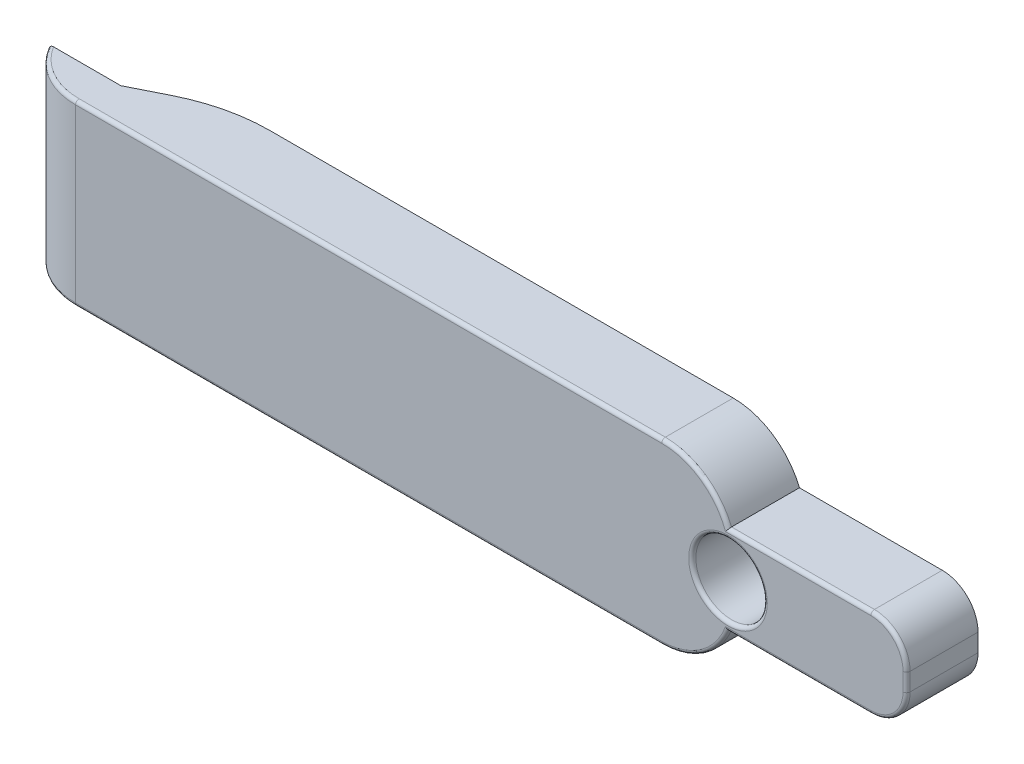
ISO-10303-21;
HEADER;
FILE_DESCRIPTION(('STEP AP214'),'2;1');
FILE_NAME('part.step','',(''),(''),'','','');
FILE_SCHEMA(('AUTOMOTIVE_DESIGN { 1 0 10303 214 1 1 1 1 }'));
ENDSEC;
DATA;
#1=APPLICATION_CONTEXT('core data for automotive mechanical design processes');
#2=APPLICATION_PROTOCOL_DEFINITION('international standard','automotive_design',2000,#1);
#3=PRODUCT_CONTEXT('',#1,'mechanical');
#4=PRODUCT('Part','Part','',(#3));
#5=PRODUCT_RELATED_PRODUCT_CATEGORY('part','',(#4));
#6=PRODUCT_DEFINITION_FORMATION('','',#4);
#7=PRODUCT_DEFINITION_CONTEXT('part definition',#1,'design');
#8=PRODUCT_DEFINITION('design','',#6,#7);
#9=PRODUCT_DEFINITION_SHAPE('','',#8);
#10=(LENGTH_UNIT() NAMED_UNIT(*) SI_UNIT(.MILLI.,.METRE.));
#11=(NAMED_UNIT(*) PLANE_ANGLE_UNIT() SI_UNIT($,.RADIAN.));
#12=(NAMED_UNIT(*) SI_UNIT($,.STERADIAN.) SOLID_ANGLE_UNIT());
#13=UNCERTAINTY_MEASURE_WITH_UNIT(LENGTH_MEASURE(1.E-05),#10,'distance_accuracy_value','');
#14=(GEOMETRIC_REPRESENTATION_CONTEXT(3) GLOBAL_UNCERTAINTY_ASSIGNED_CONTEXT((#13)) GLOBAL_UNIT_ASSIGNED_CONTEXT((#10,
#11,#12)) REPRESENTATION_CONTEXT('',''));
#15=CARTESIAN_POINT('',(0.,0.,0.));
#16=DIRECTION('',(0.,0.,1.));
#17=DIRECTION('',(1.,0.,0.));
#18=AXIS2_PLACEMENT_3D('',#15,#16,#17);
#19=CARTESIAN_POINT('',(-125.,-12.5,20.));
#20=DIRECTION('',(0.,1.,0.));
#21=DIRECTION('',(0.,0.,1.));
#22=AXIS2_PLACEMENT_3D('',#19,#20,#21);
#23=PLANE('',#22);
#24=DIRECTION('',(0.,0.,-1.));
#25=VECTOR('',#24,1.);
#26=CARTESIAN_POINT('',(115.,-12.5,20.));
#27=LINE('',#26,#25);
#28=CARTESIAN_POINT('',(115.,-12.5,0.));
#29=VERTEX_POINT('',#28);
#30=CARTESIAN_POINT('',(115.,-12.5,19.));
#31=VERTEX_POINT('',#30);
#32=EDGE_CURVE('E245',#29,#31,#27,.F.);
#33=ORIENTED_EDGE('',*,*,#32,.T.);
#34=DIRECTION('',(1.,0.,0.));
#35=VECTOR('',#34,1.);
#36=CARTESIAN_POINT('',(75.,-12.5,19.));
#37=LINE('',#36,#35);
#38=CARTESIAN_POINT('',(75.,-12.5,19.));
#39=VERTEX_POINT('',#38);
#40=EDGE_CURVE('E417',#31,#39,#37,.F.);
#41=ORIENTED_EDGE('',*,*,#40,.T.);
#42=DIRECTION('',(0.,0.,1.));
#43=VECTOR('',#42,1.);
#44=CARTESIAN_POINT('',(75.,-12.5,20.));
#45=LINE('',#44,#43);
#46=CARTESIAN_POINT('',(75.,-12.5,0.));
#47=VERTEX_POINT('',#46);
#48=EDGE_CURVE('E198',#47,#39,#45,.T.);
#49=ORIENTED_EDGE('',*,*,#48,.F.);
#50=DIRECTION('',(1.,0.,0.));
#51=VECTOR('',#50,1.);
#52=CARTESIAN_POINT('',(-125.,-12.5,0.));
#53=LINE('',#52,#51);
#54=EDGE_CURVE('E218',#47,#29,#53,.T.);
#55=ORIENTED_EDGE('',*,*,#54,.T.);
#56=EDGE_LOOP('',(#33,#41,#49,#55));
#57=FACE_BOUND('',#56,.T.);
#58=ADVANCED_FACE('F33',(#57),#23,.F.);
#59=CARTESIAN_POINT('',(-125.,12.5,20.));
#60=DIRECTION('',(0.,-1.,0.));
#61=DIRECTION('',(0.,0.,-1.));
#62=AXIS2_PLACEMENT_3D('',#59,#60,#61);
#63=PLANE('',#62);
#64=DIRECTION('',(0.,0.,-1.));
#65=VECTOR('',#64,1.);
#66=CARTESIAN_POINT('',(75.,12.5,0.));
#67=LINE('',#66,#65);
#68=CARTESIAN_POINT('',(75.,12.5,19.));
#69=VERTEX_POINT('',#68);
#70=CARTESIAN_POINT('',(75.,12.5,0.));
#71=VERTEX_POINT('',#70);
#72=EDGE_CURVE('E202',#69,#71,#67,.T.);
#73=ORIENTED_EDGE('',*,*,#72,.F.);
#74=DIRECTION('',(-1.,0.,0.));
#75=VECTOR('',#74,1.);
#76=CARTESIAN_POINT('',(115.,12.5,19.));
#77=LINE('',#76,#75);
#78=CARTESIAN_POINT('',(115.,12.5,19.));
#79=VERTEX_POINT('',#78);
#80=EDGE_CURVE('E58',#69,#79,#77,.F.);
#81=ORIENTED_EDGE('',*,*,#80,.T.);
#82=DIRECTION('',(0.,0.,-1.));
#83=VECTOR('',#82,1.);
#84=CARTESIAN_POINT('',(115.,12.5,20.));
#85=LINE('',#84,#83);
#86=CARTESIAN_POINT('',(115.,12.5,0.));
#87=VERTEX_POINT('',#86);
#88=EDGE_CURVE('E235',#79,#87,#85,.T.);
#89=ORIENTED_EDGE('',*,*,#88,.T.);
#90=DIRECTION('',(-1.,0.,0.));
#91=VECTOR('',#90,1.);
#92=CARTESIAN_POINT('',(-125.,12.5,0.));
#93=LINE('',#92,#91);
#94=EDGE_CURVE('E215',#87,#71,#93,.T.);
#95=ORIENTED_EDGE('',*,*,#94,.T.);
#96=EDGE_LOOP('',(#73,#81,#89,#95));
#97=FACE_BOUND('',#96,.T.);
#98=ADVANCED_FACE('F302',(#97),#63,.F.);
#99=CARTESIAN_POINT('',(125.,12.5,20.));
#100=DIRECTION('',(-1.,0.,0.));
#101=DIRECTION('',(0.,0.,1.));
#102=AXIS2_PLACEMENT_3D('',#99,#100,#101);
#103=PLANE('',#102);
#104=DIRECTION('',(0.,0.,-1.));
#105=VECTOR('',#104,1.);
#106=CARTESIAN_POINT('',(125.,2.5,20.));
#107=LINE('',#106,#105);
#108=CARTESIAN_POINT('',(125.,2.5,0.));
#109=VERTEX_POINT('',#108);
#110=CARTESIAN_POINT('',(125.,2.5,19.));
#111=VERTEX_POINT('',#110);
#112=EDGE_CURVE('E243',#109,#111,#107,.F.);
#113=ORIENTED_EDGE('',*,*,#112,.T.);
#114=DIRECTION('',(0.,1.,0.));
#115=VECTOR('',#114,1.);
#116=CARTESIAN_POINT('',(125.,-2.5,19.));
#117=LINE('',#116,#115);
#118=CARTESIAN_POINT('',(125.,-2.5,19.));
#119=VERTEX_POINT('',#118);
#120=EDGE_CURVE('E42',#111,#119,#117,.F.);
#121=ORIENTED_EDGE('',*,*,#120,.T.);
#122=DIRECTION('',(0.,0.,-1.));
#123=VECTOR('',#122,1.);
#124=CARTESIAN_POINT('',(125.,-2.5,20.));
#125=LINE('',#124,#123);
#126=CARTESIAN_POINT('',(125.,-2.5,0.));
#127=VERTEX_POINT('',#126);
#128=EDGE_CURVE('E241',#119,#127,#125,.T.);
#129=ORIENTED_EDGE('',*,*,#128,.T.);
#130=DIRECTION('',(0.,1.,0.));
#131=VECTOR('',#130,1.);
#132=CARTESIAN_POINT('',(125.,12.5,0.));
#133=LINE('',#132,#131);
#134=EDGE_CURVE('E212',#127,#109,#133,.T.);
#135=ORIENTED_EDGE('',*,*,#134,.T.);
#136=EDGE_LOOP('',(#113,#121,#129,#135));
#137=FACE_BOUND('',#136,.T.);
#138=ADVANCED_FACE('F295',(#137),#103,.F.);
#139=CARTESIAN_POINT('',(0.,0.,20.));
#140=DIRECTION('',(0.,0.,1.));
#141=DIRECTION('',(1.,0.,0.));
#142=AXIS2_PLACEMENT_3D('',#139,#140,#141);
#143=PLANE('',#142);
#144=DIRECTION('',(0.,1.,0.));
#145=VECTOR('',#144,1.);
#146=CARTESIAN_POINT('',(-107.679491924311,-25.,20.));
#147=LINE('',#146,#145);
#148=CARTESIAN_POINT('',(-107.679491924311,24.,20.));
#149=VERTEX_POINT('',#148);
#150=CARTESIAN_POINT('',(-107.679491924311,-24.,20.));
#151=VERTEX_POINT('',#150);
#152=EDGE_CURVE('E221',#149,#151,#147,.F.);
#153=ORIENTED_EDGE('',*,*,#152,.T.);
#154=DIRECTION('',(-1.,0.,0.));
#155=VECTOR('',#154,1.);
#156=CARTESIAN_POINT('',(0.,-24.,20.));
#157=LINE('',#156,#155);
#158=CARTESIAN_POINT('',(56.4595037822609,-24.,20.));
#159=VERTEX_POINT('',#158);
#160=EDGE_CURVE('E430',#151,#159,#157,.F.);
#161=ORIENTED_EDGE('',*,*,#160,.T.);
#162=CARTESIAN_POINT('',(56.4595037822609,-5.,20.));
#163=DIRECTION('',(0.,0.,1.));
#164=DIRECTION('',(1.,0.,0.));
#165=AXIS2_PLACEMENT_3D('',#162,#163,#164);
#166=CIRCLE('',#165,19.);
#167=CARTESIAN_POINT('',(74.313074853618,-11.5,20.));
#168=VERTEX_POINT('',#167);
#169=EDGE_CURVE('E434',#159,#168,#166,.T.);
#170=ORIENTED_EDGE('',*,*,#169,.T.);
#171=DIRECTION('',(1.,0.,0.));
#172=VECTOR('',#171,1.);
#173=CARTESIAN_POINT('',(115.,-11.5,20.));
#174=LINE('',#173,#172);
#175=CARTESIAN_POINT('',(115.,-11.5,20.));
#176=VERTEX_POINT('',#175);
#177=EDGE_CURVE('E437',#168,#176,#174,.T.);
#178=ORIENTED_EDGE('',*,*,#177,.T.);
#179=CARTESIAN_POINT('',(115.,-2.5,20.));
#180=DIRECTION('',(0.,0.,1.));
#181=DIRECTION('',(1.,0.,0.));
#182=AXIS2_PLACEMENT_3D('',#179,#180,#181);
#183=CIRCLE('',#182,9.);
#184=CARTESIAN_POINT('',(124.,-2.5,20.));
#185=VERTEX_POINT('',#184);
#186=EDGE_CURVE('E441',#176,#185,#183,.T.);
#187=ORIENTED_EDGE('',*,*,#186,.T.);
#188=DIRECTION('',(0.,1.,0.));
#189=VECTOR('',#188,1.);
#190=CARTESIAN_POINT('',(124.,2.5,20.));
#191=LINE('',#190,#189);
#192=CARTESIAN_POINT('',(124.,2.5,20.));
#193=VERTEX_POINT('',#192);
#194=EDGE_CURVE('E464',#185,#193,#191,.T.);
#195=ORIENTED_EDGE('',*,*,#194,.T.);
#196=CARTESIAN_POINT('',(115.,2.5,20.));
#197=DIRECTION('',(0.,0.,1.));
#198=DIRECTION('',(1.,0.,0.));
#199=AXIS2_PLACEMENT_3D('',#196,#197,#198);
#200=CIRCLE('',#199,9.);
#201=CARTESIAN_POINT('',(115.,11.5,20.));
#202=VERTEX_POINT('',#201);
#203=EDGE_CURVE('E462',#193,#202,#200,.T.);
#204=ORIENTED_EDGE('',*,*,#203,.T.);
#205=DIRECTION('',(-1.,0.,0.));
#206=VECTOR('',#205,1.);
#207=CARTESIAN_POINT('',(75.,11.5,20.));
#208=LINE('',#207,#206);
#209=CARTESIAN_POINT('',(74.313074853618,11.5,20.));
#210=VERTEX_POINT('',#209);
#211=EDGE_CURVE('E460',#202,#210,#208,.T.);
#212=ORIENTED_EDGE('',*,*,#211,.T.);
#213=CARTESIAN_POINT('',(56.4595037822609,5.,20.));
#214=DIRECTION('',(0.,0.,1.));
#215=DIRECTION('',(1.,0.,0.));
#216=AXIS2_PLACEMENT_3D('',#213,#214,#215);
#217=CIRCLE('',#216,19.);
#218=CARTESIAN_POINT('',(56.4595037822609,24.,20.));
#219=VERTEX_POINT('',#218);
#220=EDGE_CURVE('E411',#210,#219,#217,.T.);
#221=ORIENTED_EDGE('',*,*,#220,.T.);
#222=DIRECTION('',(1.,0.,0.));
#223=VECTOR('',#222,1.);
#224=CARTESIAN_POINT('',(0.,24.,20.));
#225=LINE('',#224,#223);
#226=EDGE_CURVE('E403',#219,#149,#225,.F.);
#227=ORIENTED_EDGE('',*,*,#226,.T.);
#228=EDGE_LOOP('',(#153,#161,#170,#178,#187,#195,#204,#212,#221,#227));
#229=FACE_BOUND('',#228,.T.);
#230=CARTESIAN_POINT('',(75.,0.,20.));
#231=DIRECTION('',(0.,0.,1.));
#232=DIRECTION('',(1.,0.,0.));
#233=AXIS2_PLACEMENT_3D('',#230,#231,#232);
#234=CIRCLE('',#233,11.);
#235=CARTESIAN_POINT('',(86.,0.,20.));
#236=VERTEX_POINT('',#235);
#237=EDGE_CURVE('E466',#236,#236,#234,.F.);
#238=ORIENTED_EDGE('',*,*,#237,.T.);
#239=EDGE_LOOP('',(#238));
#240=FACE_BOUND('',#239,.T.);
#241=ADVANCED_FACE('F292',(#229,#240),#143,.T.);
#242=CARTESIAN_POINT('',(0.,0.,0.));
#243=DIRECTION('',(0.,0.,1.));
#244=DIRECTION('',(1.,0.,0.));
#245=AXIS2_PLACEMENT_3D('',#242,#243,#244);
#246=PLANE('',#245);
#247=CARTESIAN_POINT('',(75.,0.,0.));
#248=DIRECTION('',(0.,0.,1.));
#249=DIRECTION('',(1.,0.,0.));
#250=AXIS2_PLACEMENT_3D('',#247,#248,#249);
#251=CIRCLE('',#250,9.99999999999999);
#252=CARTESIAN_POINT('',(85.,0.,0.));
#253=VERTEX_POINT('',#252);
#254=EDGE_CURVE('E208',#253,#253,#251,.T.);
#255=ORIENTED_EDGE('',*,*,#254,.T.);
#256=EDGE_LOOP('',(#255));
#257=FACE_BOUND('',#256,.T.);
#258=DIRECTION('',(1.,0.,0.));
#259=VECTOR('',#258,1.);
#260=CARTESIAN_POINT('',(-125.,-25.,0.));
#261=LINE('',#260,#259);
#262=CARTESIAN_POINT('',(-73.1966011250105,-25.,0.));
#263=VERTEX_POINT('',#262);
#264=CARTESIAN_POINT('',(56.4595037822609,-25.,0.));
#265=VERTEX_POINT('',#264);
#266=EDGE_CURVE('E200',#263,#265,#261,.T.);
#267=ORIENTED_EDGE('',*,*,#266,.F.);
#268=DIRECTION('',(0.,1.,0.));
#269=VECTOR('',#268,1.);
#270=CARTESIAN_POINT('',(-73.1966011250105,0.,0.));
#271=LINE('',#270,#269);
#272=CARTESIAN_POINT('',(-73.1966011250105,25.,0.));
#273=VERTEX_POINT('',#272);
#274=EDGE_CURVE('E248',#263,#273,#271,.T.);
#275=ORIENTED_EDGE('',*,*,#274,.T.);
#276=DIRECTION('',(-1.,0.,0.));
#277=VECTOR('',#276,1.);
#278=CARTESIAN_POINT('',(-125.,25.,0.));
#279=LINE('',#278,#277);
#280=CARTESIAN_POINT('',(56.4595037822609,25.,0.));
#281=VERTEX_POINT('',#280);
#282=EDGE_CURVE('E205',#281,#273,#279,.T.);
#283=ORIENTED_EDGE('',*,*,#282,.F.);
#284=CARTESIAN_POINT('',(56.4595037822609,5.,0.));
#285=DIRECTION('',(0.,0.,1.));
#286=DIRECTION('',(1.,0.,0.));
#287=AXIS2_PLACEMENT_3D('',#284,#285,#286);
#288=CIRCLE('',#287,20.);
#289=EDGE_CURVE('E227',#281,#71,#288,.F.);
#290=ORIENTED_EDGE('',*,*,#289,.T.);
#291=ORIENTED_EDGE('',*,*,#94,.F.);
#292=CARTESIAN_POINT('',(115.,2.5,0.));
#293=DIRECTION('',(0.,0.,1.));
#294=DIRECTION('',(1.,0.,0.));
#295=AXIS2_PLACEMENT_3D('',#292,#293,#294);
#296=CIRCLE('',#295,10.);
#297=EDGE_CURVE('E239',#87,#109,#296,.F.);
#298=ORIENTED_EDGE('',*,*,#297,.T.);
#299=ORIENTED_EDGE('',*,*,#134,.F.);
#300=CARTESIAN_POINT('',(115.,-2.5,0.));
#301=DIRECTION('',(0.,0.,1.));
#302=DIRECTION('',(1.,0.,0.));
#303=AXIS2_PLACEMENT_3D('',#300,#301,#302);
#304=CIRCLE('',#303,10.);
#305=EDGE_CURVE('E237',#127,#29,#304,.F.);
#306=ORIENTED_EDGE('',*,*,#305,.T.);
#307=ORIENTED_EDGE('',*,*,#54,.F.);
#308=CARTESIAN_POINT('',(56.4595037822609,-5.,0.));
#309=DIRECTION('',(0.,0.,1.));
#310=DIRECTION('',(1.,0.,0.));
#311=AXIS2_PLACEMENT_3D('',#308,#309,#310);
#312=CIRCLE('',#311,20.);
#313=EDGE_CURVE('E230',#47,#265,#312,.F.);
#314=ORIENTED_EDGE('',*,*,#313,.T.);
#315=EDGE_LOOP('',(#267,#275,#283,#290,#291,#298,#299,#306,#307,#314));
#316=FACE_BOUND('',#315,.T.);
#317=ADVANCED_FACE('F290',(#257,#316),#246,.F.);
#318=CARTESIAN_POINT('',(75.,0.,0.));
#319=DIRECTION('',(0.,0.,1.));
#320=DIRECTION('',(1.,0.,0.));
#321=AXIS2_PLACEMENT_3D('',#318,#319,#320);
#322=CYLINDRICAL_SURFACE('',#321,9.99999999999999);
#323=CARTESIAN_POINT('',(75.,0.,19.));
#324=DIRECTION('',(0.,0.,1.));
#325=DIRECTION('',(1.,0.,0.));
#326=AXIS2_PLACEMENT_3D('',#323,#324,#325);
#327=CIRCLE('',#326,9.99999999999999);
#328=CARTESIAN_POINT('',(85.,0.,19.));
#329=VERTEX_POINT('',#328);
#330=EDGE_CURVE('E11',#329,#329,#327,.T.);
#331=ORIENTED_EDGE('',*,*,#330,.T.);
#332=EDGE_LOOP('',(#331));
#333=FACE_BOUND('',#332,.T.);
#334=ORIENTED_EDGE('',*,*,#254,.F.);
#335=EDGE_LOOP('',(#334));
#336=FACE_BOUND('',#335,.T.);
#337=ADVANCED_FACE('F286',(#333,#336),#322,.F.);
#338=CARTESIAN_POINT('',(0.,25.,0.));
#339=DIRECTION('',(0.,1.,0.));
#340=DIRECTION('',(0.,0.,1.));
#341=AXIS2_PLACEMENT_3D('',#338,#339,#340);
#342=PLANE('',#341);
#343=DIRECTION('',(1.,0.,0.));
#344=VECTOR('',#343,1.);
#345=CARTESIAN_POINT('',(0.,25.,9.99999999999999));
#346=LINE('',#345,#344);
#347=CARTESIAN_POINT('',(-123.834986345715,25.,9.99999999999999));
#348=VERTEX_POINT('',#347);
#349=CARTESIAN_POINT('',(-105.,25.,9.99999999999999));
#350=VERTEX_POINT('',#349);
#351=EDGE_CURVE('E184',#348,#350,#346,.T.);
#352=ORIENTED_EDGE('',*,*,#351,.F.);
#353=CARTESIAN_POINT('',(-107.679491924311,25.,0.));
#354=DIRECTION('',(0.,1.,0.));
#355=DIRECTION('',(0.,0.,1.));
#356=AXIS2_PLACEMENT_3D('',#353,#354,#355);
#357=CIRCLE('',#356,19.);
#358=CARTESIAN_POINT('',(-107.679491924311,25.,19.));
#359=VERTEX_POINT('',#358);
#360=EDGE_CURVE('E469',#348,#359,#357,.T.);
#361=ORIENTED_EDGE('',*,*,#360,.T.);
#362=DIRECTION('',(1.,0.,0.));
#363=VECTOR('',#362,1.);
#364=CARTESIAN_POINT('',(0.,25.,19.));
#365=LINE('',#364,#363);
#366=CARTESIAN_POINT('',(56.4595037822609,25.,19.));
#367=VERTEX_POINT('',#366);
#368=EDGE_CURVE('E405',#359,#367,#365,.T.);
#369=ORIENTED_EDGE('',*,*,#368,.T.);
#370=DIRECTION('',(0.,0.,-1.));
#371=VECTOR('',#370,1.);
#372=CARTESIAN_POINT('',(56.4595037822609,25.,0.));
#373=LINE('',#372,#371);
#374=EDGE_CURVE('E233',#367,#281,#373,.T.);
#375=ORIENTED_EDGE('',*,*,#374,.T.);
#376=ORIENTED_EDGE('',*,*,#282,.T.);
#377=CARTESIAN_POINT('',(-73.1966011250105,25.,50.));
#378=DIRECTION('',(0.,1.,0.));
#379=DIRECTION('',(0.,0.,1.));
#380=AXIS2_PLACEMENT_3D('',#377,#378,#379);
#381=CIRCLE('',#380,50.);
#382=CARTESIAN_POINT('',(-95.5572809000084,25.,5.27864045000422));
#383=VERTEX_POINT('',#382);
#384=EDGE_CURVE('E251',#273,#383,#381,.T.);
#385=ORIENTED_EDGE('',*,*,#384,.T.);
#386=DIRECTION('',(0.894427190999916,0.,-0.447213595499958));
#387=VECTOR('',#386,1.);
#388=CARTESIAN_POINT('',(-17.,25.,-34.));
#389=LINE('',#388,#387);
#390=EDGE_CURVE('E178',#350,#383,#389,.T.);
#391=ORIENTED_EDGE('',*,*,#390,.F.);
#392=EDGE_LOOP('',(#352,#361,#369,#375,#376,#385,#391));
#393=FACE_BOUND('',#392,.T.);
#394=ADVANCED_FACE('F283',(#393),#342,.T.);
#395=CARTESIAN_POINT('',(0.,-25.,0.));
#396=DIRECTION('',(0.,-1.,0.));
#397=DIRECTION('',(0.,0.,-1.));
#398=AXIS2_PLACEMENT_3D('',#395,#396,#397);
#399=PLANE('',#398);
#400=DIRECTION('',(-1.,0.,0.));
#401=VECTOR('',#400,1.);
#402=CARTESIAN_POINT('',(0.,-25.,19.));
#403=LINE('',#402,#401);
#404=CARTESIAN_POINT('',(56.4595037822609,-25.,19.));
#405=VERTEX_POINT('',#404);
#406=CARTESIAN_POINT('',(-107.679491924311,-25.,19.));
#407=VERTEX_POINT('',#406);
#408=EDGE_CURVE('E256',#405,#407,#403,.T.);
#409=ORIENTED_EDGE('',*,*,#408,.T.);
#410=CARTESIAN_POINT('',(-107.679491924311,-25.,0.));
#411=DIRECTION('',(0.,-1.,0.));
#412=DIRECTION('',(0.,0.,-1.));
#413=AXIS2_PLACEMENT_3D('',#410,#411,#412);
#414=CIRCLE('',#413,19.);
#415=CARTESIAN_POINT('',(-123.834986345715,-25.,9.99999999999999));
#416=VERTEX_POINT('',#415);
#417=EDGE_CURVE('E176',#407,#416,#414,.T.);
#418=ORIENTED_EDGE('',*,*,#417,.T.);
#419=DIRECTION('',(1.,0.,0.));
#420=VECTOR('',#419,1.);
#421=CARTESIAN_POINT('',(0.,-25.,9.99999999999999));
#422=LINE('',#421,#420);
#423=CARTESIAN_POINT('',(-105.,-25.,9.99999999999999));
#424=VERTEX_POINT('',#423);
#425=EDGE_CURVE('E169',#416,#424,#422,.T.);
#426=ORIENTED_EDGE('',*,*,#425,.T.);
#427=DIRECTION('',(0.894427190999916,0.,-0.447213595499958));
#428=VECTOR('',#427,1.);
#429=CARTESIAN_POINT('',(-17.,-25.,-34.));
#430=LINE('',#429,#428);
#431=CARTESIAN_POINT('',(-95.5572809000084,-25.,5.27864045000422));
#432=VERTEX_POINT('',#431);
#433=EDGE_CURVE('E173',#424,#432,#430,.T.);
#434=ORIENTED_EDGE('',*,*,#433,.T.);
#435=CARTESIAN_POINT('',(-73.1966011250105,-25.,50.));
#436=DIRECTION('',(0.,-1.,0.));
#437=DIRECTION('',(0.,0.,-1.));
#438=AXIS2_PLACEMENT_3D('',#435,#436,#437);
#439=CIRCLE('',#438,50.);
#440=EDGE_CURVE('E254',#432,#263,#439,.T.);
#441=ORIENTED_EDGE('',*,*,#440,.T.);
#442=ORIENTED_EDGE('',*,*,#266,.T.);
#443=DIRECTION('',(0.,0.,1.));
#444=VECTOR('',#443,1.);
#445=CARTESIAN_POINT('',(56.4595037822609,-25.,20.));
#446=LINE('',#445,#444);
#447=EDGE_CURVE('E224',#265,#405,#446,.T.);
#448=ORIENTED_EDGE('',*,*,#447,.T.);
#449=EDGE_LOOP('',(#409,#418,#426,#434,#441,#442,#448));
#450=FACE_BOUND('',#449,.T.);
#451=ADVANCED_FACE('F171',(#450),#399,.T.);
#452=CARTESIAN_POINT('',(0.,-25.,9.99999999999999));
#453=DIRECTION('',(0.,0.,1.));
#454=DIRECTION('',(1.,0.,0.));
#455=AXIS2_PLACEMENT_3D('',#452,#453,#454);
#456=PLANE('',#455);
#457=ORIENTED_EDGE('',*,*,#425,.F.);
#458=CARTESIAN_POINT('',(-123.834986345715,-25.,10.));
#459=CARTESIAN_POINT('',(-123.919917220122,-25.0000285599102,10.));
#460=CARTESIAN_POINT('',(-124.005030309426,-24.9921723234084,9.99999999999999));
#461=CARTESIAN_POINT('',(-124.172864695107,-24.9604349438292,9.99999999999999));
#462=CARTESIAN_POINT('',(-124.255562775183,-24.9364319367959,9.99999999999999));
#463=CARTESIAN_POINT('',(-124.40496765522,-24.8759618621725,9.99999999999999));
#464=CARTESIAN_POINT('',(-124.472406753829,-24.8413158320357,9.99999999999999));
#465=CARTESIAN_POINT('',(-124.599101877342,-24.7596942646283,9.99999999999999));
#466=CARTESIAN_POINT('',(-124.658392407145,-24.7127733234086,9.99999999999999));
#467=CARTESIAN_POINT('',(-124.751303753561,-24.6216155492239,9.99999999999999));
#468=CARTESIAN_POINT('',(-124.787544647487,-24.5800328140528,9.99999999999999));
#469=CARTESIAN_POINT('',(-124.852658949184,-24.4913701268911,9.99999999999999));
#470=CARTESIAN_POINT('',(-124.881529874594,-24.4442883304633,9.99999999999999));
#471=CARTESIAN_POINT('',(-124.930655600588,-24.3454877469404,9.99999999999999));
#472=CARTESIAN_POINT('',(-124.950862570228,-24.2937450795241,9.99999999999999));
#473=CARTESIAN_POINT('',(-124.981280625944,-24.1874550590689,9.99999999999999));
#474=CARTESIAN_POINT('',(-124.991515711746,-24.1329147741831,9.99999999999999));
#475=CARTESIAN_POINT('',(-124.997655527604,-24.0650230622574,9.99999999999999));
#476=CARTESIAN_POINT('',(-124.998534898402,-24.0520244947294,9.99999999999999));
#477=CARTESIAN_POINT('',(-124.99970615752,-24.0260191155274,9.99999999999999));
#478=CARTESIAN_POINT('',(-124.999998865853,-24.0130123408161,9.99999999999999));
#479=CARTESIAN_POINT('',(-125.,-24.,9.99999999999999));
#480=B_SPLINE_CURVE_WITH_KNOTS('',3,(#458,#459,#460,#461,#462,#463,#464,#465,#466,#467,#468,
#469,#470,#471,#472,#473,#474,#475,#476,#477,#478,#479),.UNSPECIFIED.,.F.,.F.,(4,2,2,2,2,2,2,2,
2,2,4),(0.,0.254740994574176,0.511426484328141,0.737595952457424,0.962776084734743,
1.12757398182066,1.29242731327823,1.45817938199818,1.62353153594141,1.66260880248924,
1.70163141014112),.UNSPECIFIED.);
#481=CARTESIAN_POINT('',(-125.,-24.,9.99999999999999));
#482=VERTEX_POINT('',#481);
#483=EDGE_CURVE('E266',#416,#482,#480,.T.);
#484=ORIENTED_EDGE('',*,*,#483,.T.);
#485=DIRECTION('',(0.,1.,0.));
#486=VECTOR('',#485,1.);
#487=CARTESIAN_POINT('',(-125.,-25.,9.99999999999999));
#488=LINE('',#487,#486);
#489=CARTESIAN_POINT('',(-125.,24.,9.99999999999999));
#490=VERTEX_POINT('',#489);
#491=EDGE_CURVE('E188',#482,#490,#488,.T.);
#492=ORIENTED_EDGE('',*,*,#491,.T.);
#493=CARTESIAN_POINT('',(-125.,24.,9.99999999999999));
#494=CARTESIAN_POINT('',(-125.000001655922,24.0254003968338,9.99999999999999));
#495=CARTESIAN_POINT('',(-124.998881667964,24.0507875507909,9.99999999999999));
#496=CARTESIAN_POINT('',(-124.994426079495,24.1013587438421,9.99999999999999));
#497=CARTESIAN_POINT('',(-124.991091181727,24.1265428447961,9.99999999999999));
#498=CARTESIAN_POINT('',(-124.977849043962,24.201298736227,9.99999999999999));
#499=CARTESIAN_POINT('',(-124.964703716923,24.2503326834797,9.99999999999999));
#500=CARTESIAN_POINT('',(-124.930417903282,24.3454258270451,9.99999999999999));
#501=CARTESIAN_POINT('',(-124.909283772634,24.3914873542201,9.99999999999999));
#502=CARTESIAN_POINT('',(-124.859930215839,24.4796712318034,9.99999999999999));
#503=CARTESIAN_POINT('',(-124.831705019577,24.5217903357004,9.99999999999999));
#504=CARTESIAN_POINT('',(-124.767688696776,24.6032473410345,9.99999999999999));
#505=CARTESIAN_POINT('',(-124.731591881642,24.6423438839026,9.99999999999999));
#506=CARTESIAN_POINT('',(-124.654022637454,24.7147413845242,9.99999999999999));
#507=CARTESIAN_POINT('',(-124.612549378399,24.748041445571,9.99999999999999));
#508=CARTESIAN_POINT('',(-124.519864386436,24.8123823972457,9.99999999999999));
#509=CARTESIAN_POINT('',(-124.468084463238,24.84260376372,9.99999999999999));
#510=CARTESIAN_POINT('',(-124.360621986327,24.8951658886005,9.99999999999999));
#511=CARTESIAN_POINT('',(-124.304934204105,24.9174958381225,9.99999999999999));
#512=CARTESIAN_POINT('',(-124.181329229241,24.9573402841069,9.99999999999999));
#513=CARTESIAN_POINT('',(-124.112941078576,24.9733932921453,9.99999999999999));
#514=CARTESIAN_POINT('',(-123.97466856332,24.9947143309099,9.99999999999999));
#515=CARTESIAN_POINT('',(-123.904788342,25.0000090798804,9.99999999999999));
#516=CARTESIAN_POINT('',(-123.834986345715,25.,9.99999999999999));
#517=B_SPLINE_CURVE_WITH_KNOTS('',3,(#493,#494,#495,#496,#497,#498,#499,#500,#501,#502,#503,
#504,#505,#506,#507,#508,#509,#510,#511,#512,#513,#514,#515,#516),.UNSPECIFIED.,.F.,.F.,(4,2,2,
2,2,2,2,2,2,2,2,4),(0.,0.0761507241667641,0.152277298924971,0.303765353310512,0.455133135443624,
0.60662448921494,0.765625268018931,0.924650622182798,1.10380552846922,1.28320488097372,
1.49306633753481,1.7024059608673),.UNSPECIFIED.);
#518=EDGE_CURVE('E259',#490,#348,#517,.T.);
#519=ORIENTED_EDGE('',*,*,#518,.T.);
#520=ORIENTED_EDGE('',*,*,#351,.T.);
#521=DIRECTION('',(0.,1.,0.));
#522=VECTOR('',#521,1.);
#523=CARTESIAN_POINT('',(-105.,-25.,9.99999999999999));
#524=LINE('',#523,#522);
#525=EDGE_CURVE('E181',#424,#350,#524,.T.);
#526=ORIENTED_EDGE('',*,*,#525,.F.);
#527=EDGE_LOOP('',(#457,#484,#492,#519,#520,#526));
#528=FACE_BOUND('',#527,.T.);
#529=ADVANCED_FACE('F182',(#528),#456,.F.);
#530=CARTESIAN_POINT('',(-17.,-25.,-34.));
#531=DIRECTION('',(0.447213595499958,0.,0.894427190999916));
#532=DIRECTION('',(0.894427190999916,0.,-0.447213595499958));
#533=AXIS2_PLACEMENT_3D('',#530,#531,#532);
#534=PLANE('',#533);
#535=ORIENTED_EDGE('',*,*,#390,.T.);
#536=DIRECTION('',(0.,1.,0.));
#537=VECTOR('',#536,1.);
#538=CARTESIAN_POINT('',(-95.5572809000084,-25.,5.2786404500042));
#539=LINE('',#538,#537);
#540=EDGE_CURVE('E192',#383,#432,#539,.F.);
#541=ORIENTED_EDGE('',*,*,#540,.T.);
#542=ORIENTED_EDGE('',*,*,#433,.F.);
#543=ORIENTED_EDGE('',*,*,#525,.T.);
#544=EDGE_LOOP('',(#535,#541,#542,#543));
#545=FACE_BOUND('',#544,.T.);
#546=ADVANCED_FACE('F190',(#545),#534,.F.);
#547=CARTESIAN_POINT('',(-107.679491924311,12.5,0.));
#548=DIRECTION('',(0.,-1.,0.));
#549=DIRECTION('',(0.,0.,-1.));
#550=AXIS2_PLACEMENT_3D('',#547,#548,#549);
#551=CYLINDRICAL_SURFACE('',#550,20.);
#552=ORIENTED_EDGE('',*,*,#491,.F.);
#553=CARTESIAN_POINT('',(-107.679491924311,-24.,0.));
#554=DIRECTION('',(0.,-1.,0.));
#555=DIRECTION('',(0.,0.,-1.));
#556=AXIS2_PLACEMENT_3D('',#553,#554,#555);
#557=CIRCLE('',#556,20.);
#558=EDGE_CURVE('E472',#482,#151,#557,.F.);
#559=ORIENTED_EDGE('',*,*,#558,.T.);
#560=ORIENTED_EDGE('',*,*,#152,.F.);
#561=CARTESIAN_POINT('',(-107.679491924311,24.,0.));
#562=DIRECTION('',(0.,1.,0.));
#563=DIRECTION('',(0.,0.,1.));
#564=AXIS2_PLACEMENT_3D('',#561,#562,#563);
#565=CIRCLE('',#564,20.);
#566=EDGE_CURVE('E473',#149,#490,#565,.F.);
#567=ORIENTED_EDGE('',*,*,#566,.T.);
#568=EDGE_LOOP('',(#552,#559,#560,#567));
#569=FACE_BOUND('',#568,.T.);
#570=ADVANCED_FACE('F309',(#569),#551,.T.);
#571=CARTESIAN_POINT('',(56.4595037822609,-5.,20.));
#572=DIRECTION('',(0.,0.,-1.));
#573=DIRECTION('',(-1.,0.,0.));
#574=AXIS2_PLACEMENT_3D('',#571,#572,#573);
#575=CYLINDRICAL_SURFACE('',#574,20.);
#576=ORIENTED_EDGE('',*,*,#48,.T.);
#577=CARTESIAN_POINT('',(56.4595037822609,-5.,19.));
#578=DIRECTION('',(0.,0.,1.));
#579=DIRECTION('',(1.,0.,0.));
#580=AXIS2_PLACEMENT_3D('',#577,#578,#579);
#581=CIRCLE('',#580,20.);
#582=EDGE_CURVE('E414',#39,#405,#581,.F.);
#583=ORIENTED_EDGE('',*,*,#582,.T.);
#584=ORIENTED_EDGE('',*,*,#447,.F.);
#585=ORIENTED_EDGE('',*,*,#313,.F.);
#586=EDGE_LOOP('',(#576,#583,#584,#585));
#587=FACE_BOUND('',#586,.T.);
#588=ADVANCED_FACE('F312',(#587),#575,.T.);
#589=CARTESIAN_POINT('',(56.4595037822609,5.,0.));
#590=DIRECTION('',(0.,0.,1.));
#591=DIRECTION('',(1.,0.,0.));
#592=AXIS2_PLACEMENT_3D('',#589,#590,#591);
#593=CYLINDRICAL_SURFACE('',#592,20.);
#594=ORIENTED_EDGE('',*,*,#374,.F.);
#595=CARTESIAN_POINT('',(56.4595037822609,5.,19.));
#596=DIRECTION('',(0.,0.,1.));
#597=DIRECTION('',(1.,0.,0.));
#598=AXIS2_PLACEMENT_3D('',#595,#596,#597);
#599=CIRCLE('',#598,20.);
#600=EDGE_CURVE('E412',#367,#69,#599,.F.);
#601=ORIENTED_EDGE('',*,*,#600,.T.);
#602=ORIENTED_EDGE('',*,*,#72,.T.);
#603=ORIENTED_EDGE('',*,*,#289,.F.);
#604=EDGE_LOOP('',(#594,#601,#602,#603));
#605=FACE_BOUND('',#604,.T.);
#606=ADVANCED_FACE('F316',(#605),#593,.T.);
#607=CARTESIAN_POINT('',(115.,2.5,20.));
#608=DIRECTION('',(0.,0.,-1.));
#609=DIRECTION('',(-1.,0.,0.));
#610=AXIS2_PLACEMENT_3D('',#607,#608,#609);
#611=CYLINDRICAL_SURFACE('',#610,10.);
#612=ORIENTED_EDGE('',*,*,#88,.F.);
#613=CARTESIAN_POINT('',(115.,2.5,19.));
#614=DIRECTION('',(0.,0.,1.));
#615=DIRECTION('',(1.,0.,0.));
#616=AXIS2_PLACEMENT_3D('',#613,#614,#615);
#617=CIRCLE('',#616,10.);
#618=EDGE_CURVE('E50',#79,#111,#617,.F.);
#619=ORIENTED_EDGE('',*,*,#618,.T.);
#620=ORIENTED_EDGE('',*,*,#112,.F.);
#621=ORIENTED_EDGE('',*,*,#297,.F.);
#622=EDGE_LOOP('',(#612,#619,#620,#621));
#623=FACE_BOUND('',#622,.T.);
#624=ADVANCED_FACE('F320',(#623),#611,.T.);
#625=CARTESIAN_POINT('',(115.,-2.5,20.));
#626=DIRECTION('',(0.,0.,-1.));
#627=DIRECTION('',(-1.,0.,0.));
#628=AXIS2_PLACEMENT_3D('',#625,#626,#627);
#629=CYLINDRICAL_SURFACE('',#628,10.);
#630=ORIENTED_EDGE('',*,*,#128,.F.);
#631=CARTESIAN_POINT('',(115.,-2.5,19.));
#632=DIRECTION('',(0.,0.,1.));
#633=DIRECTION('',(1.,0.,0.));
#634=AXIS2_PLACEMENT_3D('',#631,#632,#633);
#635=CIRCLE('',#634,10.);
#636=EDGE_CURVE('E439',#119,#31,#635,.F.);
#637=ORIENTED_EDGE('',*,*,#636,.T.);
#638=ORIENTED_EDGE('',*,*,#32,.F.);
#639=ORIENTED_EDGE('',*,*,#305,.F.);
#640=EDGE_LOOP('',(#630,#637,#638,#639));
#641=FACE_BOUND('',#640,.T.);
#642=ADVANCED_FACE('F324',(#641),#629,.T.);
#643=CARTESIAN_POINT('',(-73.1966011250105,0.,50.));
#644=DIRECTION('',(0.,1.,0.));
#645=DIRECTION('',(0.,0.,1.));
#646=AXIS2_PLACEMENT_3D('',#643,#644,#645);
#647=CYLINDRICAL_SURFACE('',#646,50.);
#648=ORIENTED_EDGE('',*,*,#440,.F.);
#649=ORIENTED_EDGE('',*,*,#540,.F.);
#650=ORIENTED_EDGE('',*,*,#384,.F.);
#651=ORIENTED_EDGE('',*,*,#274,.F.);
#652=EDGE_LOOP('',(#648,#649,#650,#651));
#653=FACE_BOUND('',#652,.T.);
#654=ADVANCED_FACE('F327',(#653),#647,.T.);
#655=CARTESIAN_POINT('',(-107.679491924311,24.,0.));
#656=DIRECTION('',(0.,1.,0.));
#657=DIRECTION('',(0.,0.,1.));
#658=AXIS2_PLACEMENT_3D('',#655,#656,#657);
#659=TOROIDAL_SURFACE('',#658,19.,1.);
#660=ORIENTED_EDGE('',*,*,#518,.F.);
#661=ORIENTED_EDGE('',*,*,#566,.F.);
#662=CARTESIAN_POINT('',(-107.679491924311,24.,19.));
#663=DIRECTION('',(1.,0.,0.));
#664=DIRECTION('',(0.,0.,-1.));
#665=AXIS2_PLACEMENT_3D('',#662,#663,#664);
#666=CIRCLE('',#665,1.);
#667=EDGE_CURVE('E37',#359,#149,#666,.T.);
#668=ORIENTED_EDGE('',*,*,#667,.F.);
#669=ORIENTED_EDGE('',*,*,#360,.F.);
#670=EDGE_LOOP('',(#660,#661,#668,#669));
#671=FACE_BOUND('',#670,.T.);
#672=ADVANCED_FACE('F273',(#671),#659,.T.);
#673=CARTESIAN_POINT('',(0.,24.,19.));
#674=DIRECTION('',(1.,0.,0.));
#675=DIRECTION('',(0.,0.,-1.));
#676=AXIS2_PLACEMENT_3D('',#673,#674,#675);
#677=CYLINDRICAL_SURFACE('',#676,1.);
#678=ORIENTED_EDGE('',*,*,#667,.T.);
#679=ORIENTED_EDGE('',*,*,#226,.F.);
#680=CARTESIAN_POINT('',(56.4595037822609,24.,19.));
#681=DIRECTION('',(1.,0.,0.));
#682=DIRECTION('',(0.,0.,-1.));
#683=AXIS2_PLACEMENT_3D('',#680,#681,#682);
#684=CIRCLE('',#683,1.);
#685=EDGE_CURVE('E380',#367,#219,#684,.T.);
#686=ORIENTED_EDGE('',*,*,#685,.F.);
#687=ORIENTED_EDGE('',*,*,#368,.F.);
#688=EDGE_LOOP('',(#678,#679,#686,#687));
#689=FACE_BOUND('',#688,.T.);
#690=ADVANCED_FACE('F389',(#689),#677,.T.);
#691=CARTESIAN_POINT('',(56.4595037822609,5.,19.));
#692=DIRECTION('',(0.,0.,1.));
#693=DIRECTION('',(1.,0.,0.));
#694=AXIS2_PLACEMENT_3D('',#691,#692,#693);
#695=TOROIDAL_SURFACE('',#694,19.,1.);
#696=ORIENTED_EDGE('',*,*,#685,.T.);
#697=ORIENTED_EDGE('',*,*,#220,.F.);
#698=CARTESIAN_POINT('',(75.,12.5,19.));
#699=CARTESIAN_POINT('',(75.0000011779225,12.5000018976937,19.024695571269));
#700=CARTESIAN_POINT('',(74.9993827551486,12.4990844635942,19.0493778319388));
#701=CARTESIAN_POINT('',(74.9969243330351,12.4954383357305,19.0985370194079));
#702=CARTESIAN_POINT('',(74.9950848339072,12.4927103836417,19.123014026133));
#703=CARTESIAN_POINT('',(74.9877894244262,12.4818937610038,19.1956105812173));
#704=CARTESIAN_POINT('',(74.980556117661,12.4711715776448,19.2431934321699));
#705=CARTESIAN_POINT('',(74.9617382368642,12.4433037169754,19.3354120774741));
#706=CARTESIAN_POINT('',(74.9501589276887,12.4261658118955,19.3800513611182));
#707=CARTESIAN_POINT('',(74.9231779603436,12.3862833024471,19.4655420478878));
#708=CARTESIAN_POINT('',(74.9077721751378,12.3635326446376,19.5063892953449));
#709=CARTESIAN_POINT('',(74.8726915265841,12.3118063070115,19.5859694103445));
#710=CARTESIAN_POINT('',(74.8528123507289,12.2825337897732,19.6244176505843));
#711=CARTESIAN_POINT('',(74.8101189048774,12.219784774511,19.6958243470675));
#712=CARTESIAN_POINT('',(74.7873040919455,12.1863074988594,19.7287817852129));
#713=CARTESIAN_POINT('',(74.7354682655967,12.1104041520334,19.7939114856965));
#714=CARTESIAN_POINT('',(74.7060404635745,12.0674067357781,19.8250929325183));
#715=CARTESIAN_POINT('',(74.6448595515711,11.9782490147455,19.8797836213072));
#716=CARTESIAN_POINT('',(74.6131031983,11.9320843044295,19.9032819034774));
#717=CARTESIAN_POINT('',(74.538385073988,11.8237670649334,19.9484513941093));
#718=CARTESIAN_POINT('',(74.4948786581944,11.7609116646712,19.9675441903061));
#719=CARTESIAN_POINT('',(74.406536467641,11.6337614135109,19.9931274266423));
#720=CARTESIAN_POINT('',(74.3617035107307,11.5694696761854,19.9996428709896));
#721=CARTESIAN_POINT('',(74.3155694029445,11.5035631139843,19.9999952422893));
#722=CARTESIAN_POINT('',(74.3143221421077,11.5017814823945,20.0000000029543));
#723=CARTESIAN_POINT('',(74.313074853618,11.5,20.));
#724=B_SPLINE_CURVE_WITH_KNOTS('',3,(#698,#699,#700,#701,#702,#703,#704,#705,#706,#707,#708,
#709,#710,#711,#712,#713,#714,#715,#716,#717,#718,#719,#720,#721,#722,#723),.UNSPECIFIED.,.F.,
.F.,(4,2,2,2,2,2,2,2,2,2,2,2,4),(0.,0.0740361905573393,0.148042071024502,0.295173080104487,
0.442126423290585,0.589238956169167,0.745400938242297,0.901591843537984,1.08306771193247,
1.26480133198615,1.50008249081373,1.73489541893544,1.74141988969472),.UNSPECIFIED.);
#725=EDGE_CURVE('E372',#69,#210,#724,.T.);
#726=ORIENTED_EDGE('',*,*,#725,.F.);
#727=ORIENTED_EDGE('',*,*,#600,.F.);
#728=EDGE_LOOP('',(#696,#697,#726,#727));
#729=FACE_BOUND('',#728,.T.);
#730=ADVANCED_FACE('F381',(#729),#695,.T.);
#731=CARTESIAN_POINT('',(0.,11.5,19.));
#732=DIRECTION('',(1.,0.,0.));
#733=DIRECTION('',(0.,0.,-1.));
#734=AXIS2_PLACEMENT_3D('',#731,#732,#733);
#735=CYLINDRICAL_SURFACE('',#734,1.);
#736=ORIENTED_EDGE('',*,*,#725,.T.);
#737=ORIENTED_EDGE('',*,*,#211,.F.);
#738=CARTESIAN_POINT('',(115.,11.5,19.));
#739=DIRECTION('',(1.,0.,0.));
#740=DIRECTION('',(0.,0.,-1.));
#741=AXIS2_PLACEMENT_3D('',#738,#739,#740);
#742=CIRCLE('',#741,1.);
#743=EDGE_CURVE('E369',#79,#202,#742,.T.);
#744=ORIENTED_EDGE('',*,*,#743,.F.);
#745=ORIENTED_EDGE('',*,*,#80,.F.);
#746=EDGE_LOOP('',(#736,#737,#744,#745));
#747=FACE_BOUND('',#746,.T.);
#748=ADVANCED_FACE('F384',(#747),#735,.T.);
#749=CARTESIAN_POINT('',(115.,2.5,19.));
#750=DIRECTION('',(0.,0.,1.));
#751=DIRECTION('',(1.,0.,0.));
#752=AXIS2_PLACEMENT_3D('',#749,#750,#751);
#753=TOROIDAL_SURFACE('',#752,9.,1.);
#754=ORIENTED_EDGE('',*,*,#743,.T.);
#755=ORIENTED_EDGE('',*,*,#203,.F.);
#756=CARTESIAN_POINT('',(124.,2.5,19.));
#757=DIRECTION('',(0.,-1.,0.));
#758=DIRECTION('',(0.,0.,-1.));
#759=AXIS2_PLACEMENT_3D('',#756,#757,#758);
#760=CIRCLE('',#759,1.);
#761=EDGE_CURVE('E366',#111,#193,#760,.T.);
#762=ORIENTED_EDGE('',*,*,#761,.F.);
#763=ORIENTED_EDGE('',*,*,#618,.F.);
#764=EDGE_LOOP('',(#754,#755,#762,#763));
#765=FACE_BOUND('',#764,.T.);
#766=ADVANCED_FACE('F387',(#765),#753,.T.);
#767=CARTESIAN_POINT('',(124.,0.,19.));
#768=DIRECTION('',(0.,-1.,0.));
#769=DIRECTION('',(0.,0.,-1.));
#770=AXIS2_PLACEMENT_3D('',#767,#768,#769);
#771=CYLINDRICAL_SURFACE('',#770,1.);
#772=ORIENTED_EDGE('',*,*,#761,.T.);
#773=ORIENTED_EDGE('',*,*,#194,.F.);
#774=CARTESIAN_POINT('',(124.,-2.5,19.));
#775=DIRECTION('',(0.,-1.,0.));
#776=DIRECTION('',(0.,0.,-1.));
#777=AXIS2_PLACEMENT_3D('',#774,#775,#776);
#778=CIRCLE('',#777,1.);
#779=EDGE_CURVE('E363',#119,#185,#778,.T.);
#780=ORIENTED_EDGE('',*,*,#779,.F.);
#781=ORIENTED_EDGE('',*,*,#120,.F.);
#782=EDGE_LOOP('',(#772,#773,#780,#781));
#783=FACE_BOUND('',#782,.T.);
#784=ADVANCED_FACE('F484',(#783),#771,.T.);
#785=CARTESIAN_POINT('',(115.,-2.5,19.));
#786=DIRECTION('',(0.,0.,1.));
#787=DIRECTION('',(1.,0.,0.));
#788=AXIS2_PLACEMENT_3D('',#785,#786,#787);
#789=TOROIDAL_SURFACE('',#788,9.,1.);
#790=ORIENTED_EDGE('',*,*,#779,.T.);
#791=ORIENTED_EDGE('',*,*,#186,.F.);
#792=CARTESIAN_POINT('',(115.,-11.5,19.));
#793=DIRECTION('',(-1.,0.,0.));
#794=DIRECTION('',(0.,0.,1.));
#795=AXIS2_PLACEMENT_3D('',#792,#793,#794);
#796=CIRCLE('',#795,1.);
#797=EDGE_CURVE('E358',#31,#176,#796,.T.);
#798=ORIENTED_EDGE('',*,*,#797,.F.);
#799=ORIENTED_EDGE('',*,*,#636,.F.);
#800=EDGE_LOOP('',(#790,#791,#798,#799));
#801=FACE_BOUND('',#800,.T.);
#802=ADVANCED_FACE('F345',(#801),#789,.T.);
#803=CARTESIAN_POINT('',(0.,-11.5,19.));
#804=DIRECTION('',(-1.,0.,0.));
#805=DIRECTION('',(0.,0.,1.));
#806=AXIS2_PLACEMENT_3D('',#803,#804,#805);
#807=CYLINDRICAL_SURFACE('',#806,1.);
#808=ORIENTED_EDGE('',*,*,#797,.T.);
#809=ORIENTED_EDGE('',*,*,#177,.F.);
#810=CARTESIAN_POINT('',(75.,-12.5,19.));
#811=CARTESIAN_POINT('',(75.0000011779225,-12.5000018976937,19.024695571269));
#812=CARTESIAN_POINT('',(74.9993827551486,-12.4990844635942,19.0493778319388));
#813=CARTESIAN_POINT('',(74.9969243330351,-12.4954383357305,19.0985370194079));
#814=CARTESIAN_POINT('',(74.9950848339072,-12.4927103836417,19.123014026133));
#815=CARTESIAN_POINT('',(74.9877894244262,-12.4818937610038,19.1956105812173));
#816=CARTESIAN_POINT('',(74.980556117661,-12.4711715776448,19.2431934321699));
#817=CARTESIAN_POINT('',(74.9617382368642,-12.4433037169754,19.3354120774741));
#818=CARTESIAN_POINT('',(74.9501589276887,-12.4261658118955,19.3800513611182));
#819=CARTESIAN_POINT('',(74.9231779603436,-12.3862833024471,19.4655420478878));
#820=CARTESIAN_POINT('',(74.9077721751378,-12.3635326446376,19.5063892953449));
#821=CARTESIAN_POINT('',(74.8726915265841,-12.3118063070115,19.5859694103445));
#822=CARTESIAN_POINT('',(74.8528123507289,-12.2825337897733,19.6244176505843));
#823=CARTESIAN_POINT('',(74.8101189048774,-12.219784774511,19.6958243470675));
#824=CARTESIAN_POINT('',(74.7873040919455,-12.1863074988594,19.7287817852129));
#825=CARTESIAN_POINT('',(74.7354682655967,-12.1104041520334,19.7939114856965));
#826=CARTESIAN_POINT('',(74.7060404635745,-12.0674067357781,19.8250929325183));
#827=CARTESIAN_POINT('',(74.6448595515711,-11.9782490147455,19.8797836213072));
#828=CARTESIAN_POINT('',(74.6131031983,-11.9320843044295,19.9032819034774));
#829=CARTESIAN_POINT('',(74.538385073988,-11.8237670649334,19.9484513941093));
#830=CARTESIAN_POINT('',(74.4948786581944,-11.7609116646712,19.9675441903061));
#831=CARTESIAN_POINT('',(74.406536467641,-11.6337614135109,19.9931274266423));
#832=CARTESIAN_POINT('',(74.3617035107307,-11.5694696761854,19.9996428709896));
#833=CARTESIAN_POINT('',(74.3155694029444,-11.5035631139843,19.9999952422893));
#834=CARTESIAN_POINT('',(74.3143221421077,-11.5017814823945,20.0000000029543));
#835=CARTESIAN_POINT('',(74.313074853618,-11.5,20.));
#836=B_SPLINE_CURVE_WITH_KNOTS('',3,(#810,#811,#812,#813,#814,#815,#816,#817,#818,#819,#820,
#821,#822,#823,#824,#825,#826,#827,#828,#829,#830,#831,#832,#833,#834,#835),.UNSPECIFIED.,.F.,
.F.,(4,2,2,2,2,2,2,2,2,2,2,2,4),(0.,0.0740361905573393,0.148042071024502,0.295173080104487,
0.442126423290585,0.589238956169163,0.745400938242294,0.901591843537984,1.08306771193247,
1.26480133198614,1.50008249081373,1.73489541893545,1.74141988969473),.UNSPECIFIED.);
#837=EDGE_CURVE('E350',#39,#168,#836,.T.);
#838=ORIENTED_EDGE('',*,*,#837,.F.);
#839=ORIENTED_EDGE('',*,*,#40,.F.);
#840=EDGE_LOOP('',(#808,#809,#838,#839));
#841=FACE_BOUND('',#840,.T.);
#842=ADVANCED_FACE('F341',(#841),#807,.T.);
#843=CARTESIAN_POINT('',(56.4595037822609,-5.,19.));
#844=DIRECTION('',(0.,0.,1.));
#845=DIRECTION('',(1.,0.,0.));
#846=AXIS2_PLACEMENT_3D('',#843,#844,#845);
#847=TOROIDAL_SURFACE('',#846,19.,1.);
#848=ORIENTED_EDGE('',*,*,#837,.T.);
#849=ORIENTED_EDGE('',*,*,#169,.F.);
#850=CARTESIAN_POINT('',(56.4595037822609,-24.,19.));
#851=DIRECTION('',(-1.,0.,0.));
#852=DIRECTION('',(0.,0.,1.));
#853=AXIS2_PLACEMENT_3D('',#850,#851,#852);
#854=CIRCLE('',#853,1.);
#855=EDGE_CURVE('E359',#405,#159,#854,.T.);
#856=ORIENTED_EDGE('',*,*,#855,.F.);
#857=ORIENTED_EDGE('',*,*,#582,.F.);
#858=EDGE_LOOP('',(#848,#849,#856,#857));
#859=FACE_BOUND('',#858,.T.);
#860=ADVANCED_FACE('F339',(#859),#847,.T.);
#861=CARTESIAN_POINT('',(0.,-24.,19.));
#862=DIRECTION('',(-1.,0.,0.));
#863=DIRECTION('',(0.,0.,1.));
#864=AXIS2_PLACEMENT_3D('',#861,#862,#863);
#865=CYLINDRICAL_SURFACE('',#864,1.);
#866=ORIENTED_EDGE('',*,*,#855,.T.);
#867=ORIENTED_EDGE('',*,*,#160,.F.);
#868=CARTESIAN_POINT('',(-107.679491924311,-24.,19.));
#869=DIRECTION('',(-1.,0.,0.));
#870=DIRECTION('',(0.,0.,1.));
#871=AXIS2_PLACEMENT_3D('',#868,#869,#870);
#872=CIRCLE('',#871,1.);
#873=EDGE_CURVE('E422',#407,#151,#872,.T.);
#874=ORIENTED_EDGE('',*,*,#873,.F.);
#875=ORIENTED_EDGE('',*,*,#408,.F.);
#876=EDGE_LOOP('',(#866,#867,#874,#875));
#877=FACE_BOUND('',#876,.T.);
#878=ADVANCED_FACE('F335',(#877),#865,.T.);
#879=CARTESIAN_POINT('',(-107.679491924311,-24.,0.));
#880=DIRECTION('',(0.,-1.,0.));
#881=DIRECTION('',(0.,0.,-1.));
#882=AXIS2_PLACEMENT_3D('',#879,#880,#881);
#883=TOROIDAL_SURFACE('',#882,19.,1.);
#884=ORIENTED_EDGE('',*,*,#873,.T.);
#885=ORIENTED_EDGE('',*,*,#558,.F.);
#886=ORIENTED_EDGE('',*,*,#483,.F.);
#887=ORIENTED_EDGE('',*,*,#417,.F.);
#888=EDGE_LOOP('',(#884,#885,#886,#887));
#889=FACE_BOUND('',#888,.T.);
#890=ADVANCED_FACE('F331',(#889),#883,.T.);
#891=CARTESIAN_POINT('',(75.,0.,19.));
#892=DIRECTION('',(0.,0.,1.));
#893=DIRECTION('',(1.,0.,0.));
#894=AXIS2_PLACEMENT_3D('',#891,#892,#893);
#895=TOROIDAL_SURFACE('',#894,11.,1.);
#896=ORIENTED_EDGE('',*,*,#237,.F.);
#897=EDGE_LOOP('',(#896));
#898=FACE_BOUND('',#897,.T.);
#899=ORIENTED_EDGE('',*,*,#330,.F.);
#900=EDGE_LOOP('',(#899));
#901=FACE_BOUND('',#900,.T.);
#902=ADVANCED_FACE('F35',(#898,#901),#895,.T.);
#903=CLOSED_SHELL('',(#58,#98,#138,#241,#317,#337,#394,#451,#529,#546,#570,#588,#606,#624,#642,
#654,#672,#690,#730,#748,#766,#784,#802,#842,#860,#878,#890,#902));
#904=MANIFOLD_SOLID_BREP('B2',#903);
#905=ADVANCED_BREP_SHAPE_REPRESENTATION('',(#18,#904),#14);
#906=SHAPE_DEFINITION_REPRESENTATION(#9,#905);
ENDSEC;
END-ISO-10303-21;
